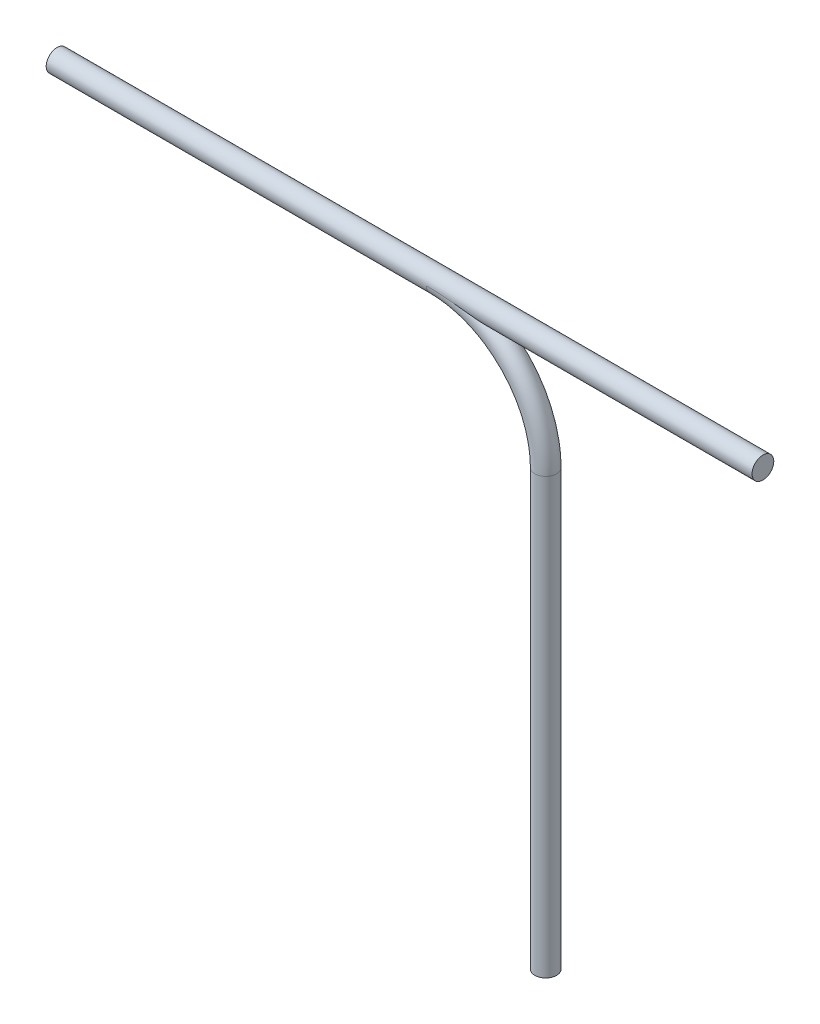
ISO-10303-21;
HEADER;
FILE_DESCRIPTION(('STEP AP214'),'2;1');
FILE_NAME('part.step','',(''),(''),'','','');
FILE_SCHEMA(('AUTOMOTIVE_DESIGN { 1 0 10303 214 1 1 1 1 }'));
ENDSEC;
DATA;
#1=APPLICATION_CONTEXT('core data for automotive mechanical design processes');
#2=APPLICATION_PROTOCOL_DEFINITION('international standard','automotive_design',2000,#1);
#3=PRODUCT_CONTEXT('',#1,'mechanical');
#4=PRODUCT('Part','Part','',(#3));
#5=PRODUCT_RELATED_PRODUCT_CATEGORY('part','',(#4));
#6=PRODUCT_DEFINITION_FORMATION('','',#4);
#7=PRODUCT_DEFINITION_CONTEXT('part definition',#1,'design');
#8=PRODUCT_DEFINITION('design','',#6,#7);
#9=PRODUCT_DEFINITION_SHAPE('','',#8);
#10=(LENGTH_UNIT() NAMED_UNIT(*) SI_UNIT(.MILLI.,.METRE.));
#11=(NAMED_UNIT(*) PLANE_ANGLE_UNIT() SI_UNIT($,.RADIAN.));
#12=(NAMED_UNIT(*) SI_UNIT($,.STERADIAN.) SOLID_ANGLE_UNIT());
#13=UNCERTAINTY_MEASURE_WITH_UNIT(LENGTH_MEASURE(1.E-05),#10,'distance_accuracy_value','');
#14=(GEOMETRIC_REPRESENTATION_CONTEXT(3) GLOBAL_UNCERTAINTY_ASSIGNED_CONTEXT((#13)) GLOBAL_UNIT_ASSIGNED_CONTEXT((#10,
#11,#12)) REPRESENTATION_CONTEXT('',''));
#15=CARTESIAN_POINT('',(0.,0.,0.));
#16=DIRECTION('',(0.,0.,1.));
#17=DIRECTION('',(1.,0.,0.));
#18=AXIS2_PLACEMENT_3D('',#15,#16,#17);
#19=CARTESIAN_POINT('',(0.,0.,0.));
#20=DIRECTION('',(1.,0.,0.));
#21=DIRECTION('',(0.,0.,-1.));
#22=AXIS2_PLACEMENT_3D('',#19,#20,#21);
#23=PLANE('',#22);
#24=CARTESIAN_POINT('',(0.,0.,0.));
#25=DIRECTION('',(1.,0.,0.));
#26=DIRECTION('',(0.,0.,-1.));
#27=AXIS2_PLACEMENT_3D('',#24,#25,#26);
#28=CIRCLE('',#27,1.);
#29=CARTESIAN_POINT('',(0.,0.,-1.));
#30=VERTEX_POINT('',#29);
#31=EDGE_CURVE('E65',#30,#30,#28,.T.);
#32=ORIENTED_EDGE('',*,*,#31,.F.);
#33=EDGE_LOOP('',(#32));
#34=FACE_BOUND('',#33,.T.);
#35=ADVANCED_FACE('F39',(#34),#23,.F.);
#36=CARTESIAN_POINT('',(45.,-50.,0.));
#37=DIRECTION('',(0.,-1.,0.));
#38=DIRECTION('',(0.,0.,-1.));
#39=AXIS2_PLACEMENT_3D('',#36,#37,#38);
#40=PLANE('',#39);
#41=CARTESIAN_POINT('',(45.,-50.,0.));
#42=DIRECTION('',(0.,-1.,0.));
#43=DIRECTION('',(0.,0.,-1.));
#44=AXIS2_PLACEMENT_3D('',#41,#42,#43);
#45=CIRCLE('',#44,1.);
#46=CARTESIAN_POINT('',(45.,-50.,-1.));
#47=VERTEX_POINT('',#46);
#48=EDGE_CURVE('E53',#47,#47,#45,.T.);
#49=ORIENTED_EDGE('',*,*,#48,.T.);
#50=EDGE_LOOP('',(#49));
#51=FACE_BOUND('',#50,.T.);
#52=ADVANCED_FACE('F70',(#51),#40,.T.);
#53=CARTESIAN_POINT('',(0.,0.,0.));
#54=DIRECTION('',(1.,0.,0.));
#55=DIRECTION('',(0.,0.,-1.));
#56=AXIS2_PLACEMENT_3D('',#53,#54,#55);
#57=CYLINDRICAL_SURFACE('',#56,1.);
#58=CARTESIAN_POINT('',(34.9999999999999,0.,0.));
#59=DIRECTION('',(1.,0.,0.));
#60=DIRECTION('',(0.,0.,-1.));
#61=AXIS2_PLACEMENT_3D('',#58,#59,#60);
#62=CIRCLE('',#61,1.);
#63=CARTESIAN_POINT('',(34.9999999999999,0.,1.));
#64=VERTEX_POINT('',#63);
#65=CARTESIAN_POINT('',(34.9999999999999,0.,-1.));
#66=VERTEX_POINT('',#65);
#67=EDGE_CURVE('E59',#64,#66,#62,.T.);
#68=ORIENTED_EDGE('',*,*,#67,.F.);
#69=CARTESIAN_POINT('',(35.,0.,-1.));
#70=CARTESIAN_POINT('',(35.0471408152504,1.54927442348124E-08,-0.99999975906248));
#71=CARTESIAN_POINT('',(35.0942816564386,-0.00016666679996838,-0.999999959430393));
#72=CARTESIAN_POINT('',(35.2069747004801,-0.000963539354273257,-0.999999757589505));
#73=CARTESIAN_POINT('',(35.2725258374808,-0.00174935159010653,-0.999999089430302));
#74=CARTESIAN_POINT('',(35.4126469464016,-0.00411790111377312,-0.999992309419027));
#75=CARTESIAN_POINT('',(35.4872153438221,-0.00579550926118104,-0.999985460328871));
#76=CARTESIAN_POINT('',(35.6167934470625,-0.00943516485906725,-0.999956636853079));
#77=CARTESIAN_POINT('',(35.6718086196593,-0.0112075173279202,-0.999939095671403));
#78=CARTESIAN_POINT('',(35.8368494974,-0.0172052585934454,-0.999860169342333));
#79=CARTESIAN_POINT('',(35.9468513261026,-0.0221109494895054,-0.999772478350819));
#80=CARTESIAN_POINT('',(36.1667557381739,-0.0337307356704715,-0.999447796209943));
#81=CARTESIAN_POINT('',(36.2766583240645,-0.0404447836255784,-0.999210808967867));
#82=CARTESIAN_POINT('',(36.4860908064035,-0.0549636874898006,-0.998512322898294));
#83=CARTESIAN_POINT('',(36.5856318708021,-0.0626083458434728,-0.99807383167053));
#84=CARTESIAN_POINT('',(36.7846052672039,-0.0793728827805182,-0.996880135345347));
#85=CARTESIAN_POINT('',(36.8840375758532,-0.0884930323134778,-0.996124872037324));
#86=CARTESIAN_POINT('',(37.182711020256,-0.118112733556442,-0.993201100175201));
#87=CARTESIAN_POINT('',(37.3817322109242,-0.140830145075368,-0.990375219021904));
#88=CARTESIAN_POINT('',(37.7789559780278,-0.192078636035265,-0.9817230908171));
#89=CARTESIAN_POINT('',(37.9771585666234,-0.220609628796211,-0.975896888498161));
#90=CARTESIAN_POINT('',(38.3725824964389,-0.283380515880204,-0.959560148350193));
#91=CARTESIAN_POINT('',(38.5698033523941,-0.317622990905281,-0.94904748936331));
#92=CARTESIAN_POINT('',(38.8644455179052,-0.373107233245478,-0.927996297315614));
#93=CARTESIAN_POINT('',(38.9624476990067,-0.392285751370084,-0.920100346485772));
#94=CARTESIAN_POINT('',(39.1579806510417,-0.431981205916269,-0.902146613493476));
#95=CARTESIAN_POINT('',(39.2555114477339,-0.45249806829525,-0.892088950855103));
#96=CARTESIAN_POINT('',(39.4501369284347,-0.494855852033261,-0.86930837843092));
#97=CARTESIAN_POINT('',(39.5472307035303,-0.516698774036844,-0.856581366597084));
#98=CARTESIAN_POINT('',(39.7406798106911,-0.561617247224976,-0.827827894900282));
#99=CARTESIAN_POINT('',(39.8370349371449,-0.584693128320142,-0.81180054863882));
#100=CARTESIAN_POINT('',(40.028624448304,-0.631947310515551,-0.775582846195693));
#101=CARTESIAN_POINT('',(40.1238595539722,-0.656124847388076,-0.755395342709341));
#102=CARTESIAN_POINT('',(40.3127537298174,-0.705411362720685,-0.709602655561167));
#103=CARTESIAN_POINT('',(40.4064138315304,-0.730519694041132,-0.684001179822035));
#104=CARTESIAN_POINT('',(40.5452173523443,-0.768681866536715,-0.639924133138839));
#105=CARTESIAN_POINT('',(40.5913078473655,-0.781515884132491,-0.624243445592761));
#106=CARTESIAN_POINT('',(40.6826184207147,-0.807251784496049,-0.590588763545883));
#107=CARTESIAN_POINT('',(40.7278387675142,-0.820153644715386,-0.572615489882531));
#108=CARTESIAN_POINT('',(40.8171549951196,-0.845932367462215,-0.533800980707449));
#109=CARTESIAN_POINT('',(40.8612487416516,-0.858809145197092,-0.512954720195139));
#110=CARTESIAN_POINT('',(40.947590623725,-0.884299444076478,-0.467643283502158));
#111=CARTESIAN_POINT('',(40.989841017366,-0.896913276831483,-0.443182705824517));
#112=CARTESIAN_POINT('',(41.0719268280013,-0.921664764573559,-0.38914789925104));
#113=CARTESIAN_POINT('',(41.111726135137,-0.933794651134546,-0.359514455344632));
#114=CARTESIAN_POINT('',(41.1857663764477,-0.95655936709249,-0.29360247103364));
#115=CARTESIAN_POINT('',(41.2200549220963,-0.967206882978751,-0.257387339954448));
#116=CARTESIAN_POINT('',(41.2601480038145,-0.979732926305075,-0.200955963591164));
#117=CARTESIAN_POINT('',(41.2705991799214,-0.983008135043681,-0.184392175911131));
#118=CARTESIAN_POINT('',(41.2892298528973,-0.988858181623643,-0.149887989896704));
#119=CARTESIAN_POINT('',(41.2974093439664,-0.99143301767686,-0.131947588047793));
#120=CARTESIAN_POINT('',(41.3109089351838,-0.995688104735215,-0.0946570420923136));
#121=CARTESIAN_POINT('',(41.3161956664872,-0.997357913989584,-0.0752932543247722));
#122=CARTESIAN_POINT('',(41.323134972166,-0.999550573059933,-0.0358665435543154));
#123=CARTESIAN_POINT('',(41.3247930147697,-1.0000751486752,-0.0158047188696934));
#124=CARTESIAN_POINT('',(41.3242885160393,-0.999915644280142,0.0221954835030157));
#125=CARTESIAN_POINT('',(41.3225006318024,-0.999350087901674,0.0401404726611009));
#126=CARTESIAN_POINT('',(41.316034152799,-0.997306930784243,0.0754482432206006));
#127=CARTESIAN_POINT('',(41.3113529615085,-0.995828510820511,0.0928104868800245));
#128=CARTESIAN_POINT('',(41.2977783010256,-0.991548846906605,0.131592912088515));
#129=CARTESIAN_POINT('',(41.2880467435076,-0.988485145052054,0.15268694797873));
#130=CARTESIAN_POINT('',(41.2655210225723,-0.981415650630717,0.192987557095534));
#131=CARTESIAN_POINT('',(41.25272017431,-0.977407802072354,0.212189879604207));
#132=CARTESIAN_POINT('',(41.2153428469495,-0.965748569284943,0.261430606765913));
#133=CARTESIAN_POINT('',(41.1887471871066,-0.957494973569634,0.289773099640752));
#134=CARTESIAN_POINT('',(41.1320061347366,-0.940017055864204,0.342245958428734));
#135=CARTESIAN_POINT('',(41.1018507278037,-0.930790003441762,0.36636394316868));
#136=CARTESIAN_POINT('',(41.0275669499453,-0.908242978736486,0.419793992690829));
#137=CARTESIAN_POINT('',(40.9824604153436,-0.894692611902879,0.447630900721752));
#138=CARTESIAN_POINT('',(40.8898376555626,-0.867200655909071,0.498800337950674));
#139=CARTESIAN_POINT('',(40.8423166402157,-0.853258315676382,0.522123433396151));
#140=CARTESIAN_POINT('',(40.745516624743,-0.82521518082845,0.565408970011587));
#141=CARTESIAN_POINT('',(40.6962298311274,-0.811113939955997,0.585353484531497));
#142=CARTESIAN_POINT('',(40.5966656892099,-0.783004675527487,0.622448587447939));
#143=CARTESIAN_POINT('',(40.5463893559284,-0.768996574345899,0.639601886986908));
#144=CARTESIAN_POINT('',(40.4087536559554,-0.731176518634188,0.683167562257903));
#145=CARTESIAN_POINT('',(40.3206579981783,-0.707538296089903,0.707397861180815));
#146=CARTESIAN_POINT('',(40.1430423626,-0.66107451919488,0.750991302545418));
#147=CARTESIAN_POINT('',(40.053521580926,-0.638249448849634,0.770351586466349));
#148=CARTESIAN_POINT('',(39.8733308436958,-0.593530539070389,0.805312738350807));
#149=CARTESIAN_POINT('',(39.7826589522171,-0.571638647789938,0.820906031088338));
#150=CARTESIAN_POINT('',(39.600588099179,-0.528927917349408,0.84905002710807));
#151=CARTESIAN_POINT('',(39.5091890283113,-0.508109243170668,0.861600263685253));
#152=CARTESIAN_POINT('',(39.2341046820402,-0.44735066998387,0.895571196026383));
#153=CARTESIAN_POINT('',(39.049584864266,-0.40912130250678,0.913302685363902));
#154=CARTESIAN_POINT('',(38.6793275331407,-0.337579783223373,0.942078008704233));
#155=CARTESIAN_POINT('',(38.4935915293482,-0.304262427660819,0.95312895908818));
#156=CARTESIAN_POINT('',(38.1956725761617,-0.254996265597068,0.967130988422882));
#157=CARTESIAN_POINT('',(38.0838195681391,-0.237434951816173,0.971553532252783));
#158=CARTESIAN_POINT('',(37.8597813470648,-0.2041449459535,0.979089232009204));
#159=CARTESIAN_POINT('',(37.7475960864495,-0.188416530697132,0.982202190331887));
#160=CARTESIAN_POINT('',(37.4109991752354,-0.144065783857318,0.990026927872242));
#161=CARTESIAN_POINT('',(37.1861795462758,-0.118217197078106,0.993239722274064));
#162=CARTESIAN_POINT('',(36.8224131944133,-0.0825493932827387,0.996677869285111));
#163=CARTESIAN_POINT('',(36.6836938964076,-0.0703887064579372,0.997576961403388));
#164=CARTESIAN_POINT('',(36.4059949440138,-0.0489385039289243,0.998860119393543));
#165=CARTESIAN_POINT('',(36.2670152336991,-0.0396496993724845,0.999244057779331));
#166=CARTESIAN_POINT('',(35.9619843375923,-0.0224467461866986,0.999792370209301));
#167=CARTESIAN_POINT('',(35.7958979679757,-0.0151462818534584,0.999899890842458));
#168=CARTESIAN_POINT('',(35.5340498657008,-0.00690122760242992,0.999980200379954));
#169=CARTESIAN_POINT('',(35.438329516054,-0.00457419360349113,0.999990786331587));
#170=CARTESIAN_POINT('',(35.2755433343278,-0.00178570373234698,0.999999132963348));
#171=CARTESIAN_POINT('',(35.2084834915299,-0.000974211875025475,0.999999785674216));
#172=CARTESIAN_POINT('',(35.0942816344707,-0.000166664120509341,0.999999937789424));
#173=CARTESIAN_POINT('',(35.0471407799709,2.00233100339202E-08,0.999999722207443));
#174=CARTESIAN_POINT('',(35.,0.,1.));
#175=B_SPLINE_CURVE_WITH_KNOTS('',3,(#69,#70,#71,#72,#73,#74,#75,#76,#77,#78,#79,#80,#81,#82,
#83,#84,#85,#86,#87,#88,#89,#90,#91,#92,#93,#94,#95,#96,#97,#98,#99,#100,#101,#102,#103,#104,
#105,#106,#107,#108,#109,#110,#111,#112,#113,#114,#115,#116,#117,#118,#119,#120,#121,#122,#123,
#124,#125,#126,#127,#128,#129,#130,#131,#132,#133,#134,#135,#136,#137,#138,#139,#140,#141,#142,
#143,#144,#145,#146,#147,#148,#149,#150,#151,#152,#153,#154,#155,#156,#157,#158,#159,#160,#161,
#162,#163,#164,#165,#166,#167,#168,#169,#170,#171,#172,#173,#174),.UNSPECIFIED.,.F.,.F.,(4,2,2,
2,2,2,2,2,2,2,2,2,2,2,2,2,2,2,2,2,2,2,2,2,2,2,2,2,2,2,2,2,2,2,2,2,2,2,2,2,2,2,2,2,2,2,2,2,2,2,2,
2,4),(0.,0.141422240118076,0.338086640392769,0.56184334740823,0.726973075906099,
1.05729024648322,1.3875987725693,1.68709231445657,1.98664091594181,2.58753107550875,
3.18841227650763,3.78956572156752,4.09005800622555,4.39053368051532,4.69147453069274,
4.99249631274655,5.29331236148167,5.59392305064348,5.74492266152371,5.89587491143416,
6.0470946168631,6.19812355589275,6.35101074474805,6.50249634204241,6.56192004189938,
6.62134389347103,6.68143949395006,6.74144447122617,6.79529088608543,6.84918569433007,
6.91908594281978,6.98913983789396,7.10766737701425,7.22653668621403,7.39026964506634,
7.55434119124052,7.71925773748676,7.8840131294845,8.16692511250039,8.45000276904469,
8.73364502803852,9.01733076097637,9.584866963765,10.1517975337347,10.4917037813255,
10.8316612991147,11.5104605930203,11.9281978613791,12.3460384889319,12.8447224179633,
13.1319595106207,13.3331502908109,13.474572530929),.UNSPECIFIED.);
#176=EDGE_CURVE('E11',#64,#66,#175,.F.);
#177=ORIENTED_EDGE('',*,*,#176,.T.);
#178=EDGE_LOOP('',(#68,#177));
#179=FACE_BOUND('',#178,.T.);
#180=ORIENTED_EDGE('',*,*,#31,.T.);
#181=EDGE_LOOP('',(#180));
#182=FACE_BOUND('',#181,.T.);
#183=CARTESIAN_POINT('',(64.9999999999999,0.,0.));
#184=DIRECTION('',(1.,0.,0.));
#185=DIRECTION('',(0.,0.,-1.));
#186=AXIS2_PLACEMENT_3D('',#183,#184,#185);
#187=CIRCLE('',#186,1.);
#188=CARTESIAN_POINT('',(64.9999999999999,0.,-1.));
#189=VERTEX_POINT('',#188);
#190=EDGE_CURVE('E77',#189,#189,#187,.T.);
#191=ORIENTED_EDGE('',*,*,#190,.F.);
#192=EDGE_LOOP('',(#191));
#193=FACE_BOUND('',#192,.T.);
#194=ADVANCED_FACE('F67',(#179,#182,#193),#57,.T.);
#195=CARTESIAN_POINT('',(35.,-10.,0.));
#196=DIRECTION('',(0.,0.,-1.));
#197=DIRECTION('',(-1.,0.,0.));
#198=AXIS2_PLACEMENT_3D('',#195,#196,#197);
#199=TOROIDAL_SURFACE('',#198,10.,1.);
#200=ORIENTED_EDGE('',*,*,#176,.F.);
#201=ORIENTED_EDGE('',*,*,#67,.T.);
#202=EDGE_LOOP('',(#200,#201));
#203=FACE_BOUND('',#202,.T.);
#204=CARTESIAN_POINT('',(45.,-10.0000000000001,0.));
#205=DIRECTION('',(0.,-1.,0.));
#206=DIRECTION('',(0.,0.,-1.));
#207=AXIS2_PLACEMENT_3D('',#204,#205,#206);
#208=CIRCLE('',#207,1.);
#209=CARTESIAN_POINT('',(45.,-10.0000000000001,-1.));
#210=VERTEX_POINT('',#209);
#211=EDGE_CURVE('E64',#210,#210,#208,.T.);
#212=ORIENTED_EDGE('',*,*,#211,.F.);
#213=EDGE_LOOP('',(#212));
#214=FACE_BOUND('',#213,.T.);
#215=ADVANCED_FACE('F60',(#203,#214),#199,.T.);
#216=CARTESIAN_POINT('',(45.,-10.0000000000001,0.));
#217=DIRECTION('',(0.,-1.,0.));
#218=DIRECTION('',(1.,0.,0.));
#219=AXIS2_PLACEMENT_3D('',#216,#217,#218);
#220=CYLINDRICAL_SURFACE('',#219,1.);
#221=ORIENTED_EDGE('',*,*,#48,.F.);
#222=EDGE_LOOP('',(#221));
#223=FACE_BOUND('',#222,.T.);
#224=ORIENTED_EDGE('',*,*,#211,.T.);
#225=EDGE_LOOP('',(#224));
#226=FACE_BOUND('',#225,.T.);
#227=ADVANCED_FACE('F91',(#223,#226),#220,.T.);
#228=CARTESIAN_POINT('',(64.9999999999999,0.,0.));
#229=DIRECTION('',(1.,0.,0.));
#230=DIRECTION('',(0.,0.,-1.));
#231=AXIS2_PLACEMENT_3D('',#228,#229,#230);
#232=PLANE('',#231);
#233=ORIENTED_EDGE('',*,*,#190,.T.);
#234=EDGE_LOOP('',(#233));
#235=FACE_BOUND('',#234,.T.);
#236=ADVANCED_FACE('F94',(#235),#232,.T.);
#237=CLOSED_SHELL('',(#35,#52,#194,#215,#227,#236));
#238=MANIFOLD_SOLID_BREP('B2',#237);
#239=ADVANCED_BREP_SHAPE_REPRESENTATION('',(#18,#238),#14);
#240=SHAPE_DEFINITION_REPRESENTATION(#9,#239);
ENDSEC;
END-ISO-10303-21;
